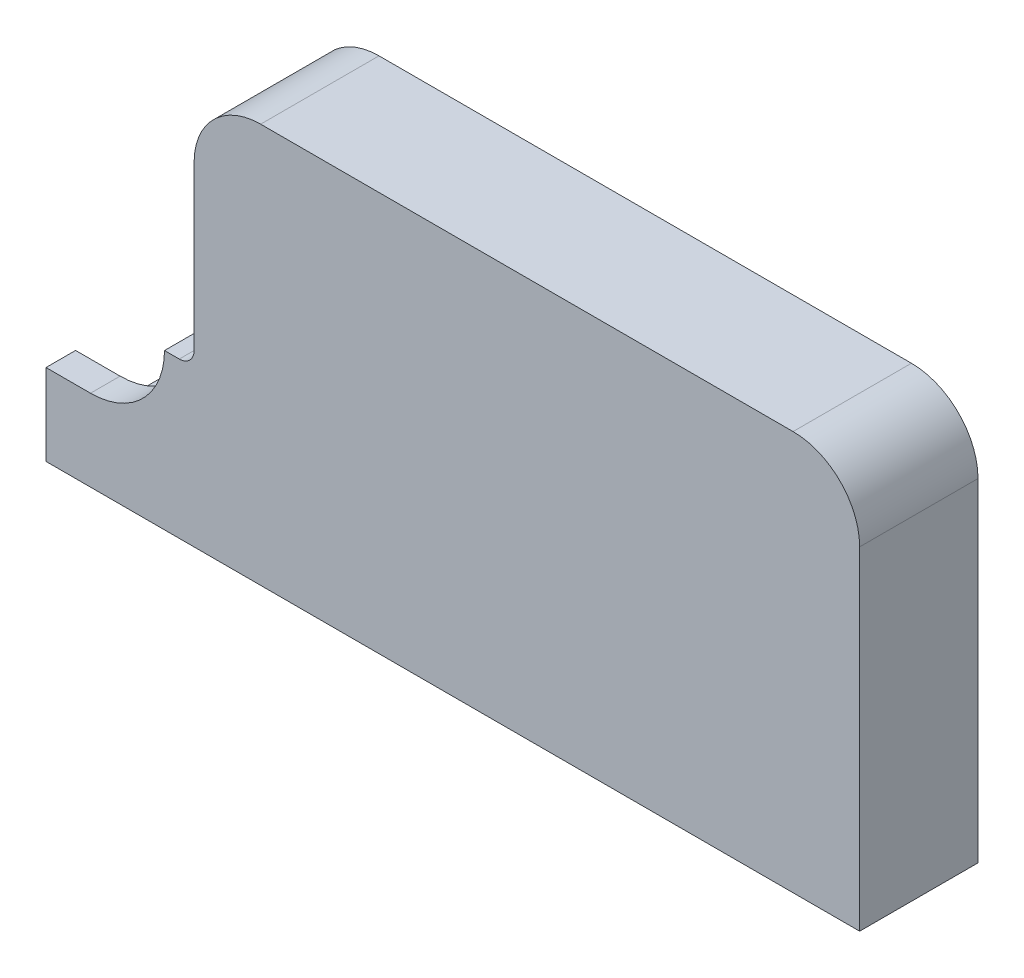
ISO-10303-21;
HEADER;
FILE_DESCRIPTION(('STEP AP214'),'2;1');
FILE_NAME('part.step','',(''),(''),'','','');
FILE_SCHEMA(('AUTOMOTIVE_DESIGN { 1 0 10303 214 1 1 1 1 }'));
ENDSEC;
DATA;
#1=APPLICATION_CONTEXT('core data for automotive mechanical design processes');
#2=APPLICATION_PROTOCOL_DEFINITION('international standard','automotive_design',2000,#1);
#3=PRODUCT_CONTEXT('',#1,'mechanical');
#4=PRODUCT('Part','Part','',(#3));
#5=PRODUCT_RELATED_PRODUCT_CATEGORY('part','',(#4));
#6=PRODUCT_DEFINITION_FORMATION('','',#4);
#7=PRODUCT_DEFINITION_CONTEXT('part definition',#1,'design');
#8=PRODUCT_DEFINITION('design','',#6,#7);
#9=PRODUCT_DEFINITION_SHAPE('','',#8);
#10=(LENGTH_UNIT() NAMED_UNIT(*) SI_UNIT(.MILLI.,.METRE.));
#11=(NAMED_UNIT(*) PLANE_ANGLE_UNIT() SI_UNIT($,.RADIAN.));
#12=(NAMED_UNIT(*) SI_UNIT($,.STERADIAN.) SOLID_ANGLE_UNIT());
#13=UNCERTAINTY_MEASURE_WITH_UNIT(LENGTH_MEASURE(1.E-05),#10,'distance_accuracy_value','');
#14=(GEOMETRIC_REPRESENTATION_CONTEXT(3) GLOBAL_UNCERTAINTY_ASSIGNED_CONTEXT((#13)) GLOBAL_UNIT_ASSIGNED_CONTEXT((#10,
#11,#12)) REPRESENTATION_CONTEXT('',''));
#15=CARTESIAN_POINT('',(0.,0.,0.));
#16=DIRECTION('',(0.,0.,1.));
#17=DIRECTION('',(1.,0.,0.));
#18=AXIS2_PLACEMENT_3D('',#15,#16,#17);
#19=CARTESIAN_POINT('',(15.009451629027,22.5275551799188,74.2698947281615));
#20=DIRECTION('',(0.,0.,-1.));
#21=DIRECTION('',(-1.,0.,0.));
#22=AXIS2_PLACEMENT_3D('',#19,#20,#21);
#23=CYLINDRICAL_SURFACE('',#22,3.5);
#24=DIRECTION('',(0.,0.,-1.));
#25=VECTOR('',#24,1.);
#26=CARTESIAN_POINT('',(15.009451629027,26.0275551799188,74.2698947281615));
#27=LINE('',#26,#25);
#28=CARTESIAN_POINT('',(15.009451629027,26.0275551799188,10.));
#29=VERTEX_POINT('',#28);
#30=CARTESIAN_POINT('',(15.009451629027,26.0275551799188,5.));
#31=VERTEX_POINT('',#30);
#32=EDGE_CURVE('E277',#29,#31,#27,.T.);
#33=ORIENTED_EDGE('',*,*,#32,.F.);
#34=CARTESIAN_POINT('',(15.009451629027,22.5275551799188,9.99999999999998));
#35=DIRECTION('',(0.,0.,1.));
#36=DIRECTION('',(1.,0.,0.));
#37=AXIS2_PLACEMENT_3D('',#34,#35,#36);
#38=CIRCLE('',#37,3.5);
#39=CARTESIAN_POINT('',(11.509451629027,22.5275551799188,10.));
#40=VERTEX_POINT('',#39);
#41=EDGE_CURVE('E342',#29,#40,#38,.T.);
#42=ORIENTED_EDGE('',*,*,#41,.T.);
#43=DIRECTION('',(0.,0.,-1.));
#44=VECTOR('',#43,1.);
#45=CARTESIAN_POINT('',(11.509451629027,22.5275551799188,74.2698947281615));
#46=LINE('',#45,#44);
#47=CARTESIAN_POINT('',(11.509451629027,22.5275551799188,5.));
#48=VERTEX_POINT('',#47);
#49=EDGE_CURVE('E225',#40,#48,#46,.T.);
#50=ORIENTED_EDGE('',*,*,#49,.T.);
#51=CARTESIAN_POINT('',(15.009451629027,22.5275551799188,5.));
#52=DIRECTION('',(0.,0.,-1.));
#53=DIRECTION('',(1.,0.,0.));
#54=AXIS2_PLACEMENT_3D('',#51,#52,#53);
#55=CIRCLE('',#54,3.5);
#56=EDGE_CURVE('E278',#48,#31,#55,.T.);
#57=ORIENTED_EDGE('',*,*,#56,.T.);
#58=EDGE_LOOP('',(#33,#42,#50,#57));
#59=FACE_BOUND('',#58,.T.);
#60=ADVANCED_FACE('F33',(#59),#23,.F.);
#61=CARTESIAN_POINT('',(15.009451629027,26.0275551799188,74.2698947281615));
#62=DIRECTION('',(0.,1.,0.));
#63=DIRECTION('',(0.,0.,1.));
#64=AXIS2_PLACEMENT_3D('',#61,#62,#63);
#65=PLANE('',#64);
#66=DIRECTION('',(0.,0.,-1.));
#67=VECTOR('',#66,1.);
#68=CARTESIAN_POINT('',(51.,26.0275551799188,74.2698947281615));
#69=LINE('',#68,#67);
#70=CARTESIAN_POINT('',(51.,26.0275551799188,10.));
#71=VERTEX_POINT('',#70);
#72=CARTESIAN_POINT('',(51.,26.0275551799188,5.));
#73=VERTEX_POINT('',#72);
#74=EDGE_CURVE('E273',#71,#73,#69,.T.);
#75=ORIENTED_EDGE('',*,*,#74,.F.);
#76=DIRECTION('',(1.,0.,0.));
#77=VECTOR('',#76,1.);
#78=CARTESIAN_POINT('',(15.009451629027,26.0275551799188,9.99999999999999));
#79=LINE('',#78,#77);
#80=EDGE_CURVE('E349',#71,#29,#79,.F.);
#81=ORIENTED_EDGE('',*,*,#80,.T.);
#82=ORIENTED_EDGE('',*,*,#32,.T.);
#83=DIRECTION('',(1.,0.,0.));
#84=VECTOR('',#83,1.);
#85=CARTESIAN_POINT('',(15.009451629027,26.0275551799188,5.));
#86=LINE('',#85,#84);
#87=EDGE_CURVE('E274',#31,#73,#86,.T.);
#88=ORIENTED_EDGE('',*,*,#87,.T.);
#89=EDGE_LOOP('',(#75,#81,#82,#88));
#90=FACE_BOUND('',#89,.T.);
#91=ADVANCED_FACE('F448',(#90),#65,.F.);
#92=CARTESIAN_POINT('',(51.,22.5275551799188,74.2698947281615));
#93=DIRECTION('',(0.,0.,-1.));
#94=DIRECTION('',(-1.,0.,0.));
#95=AXIS2_PLACEMENT_3D('',#92,#93,#94);
#96=CYLINDRICAL_SURFACE('',#95,3.49999999999999);
#97=DIRECTION('',(0.,0.,-1.));
#98=VECTOR('',#97,1.);
#99=CARTESIAN_POINT('',(54.5,22.5275551799188,74.2698947281615));
#100=LINE('',#99,#98);
#101=CARTESIAN_POINT('',(54.5,22.5275551799188,10.));
#102=VERTEX_POINT('',#101);
#103=CARTESIAN_POINT('',(54.5,22.5275551799188,5.));
#104=VERTEX_POINT('',#103);
#105=EDGE_CURVE('E269',#102,#104,#100,.T.);
#106=ORIENTED_EDGE('',*,*,#105,.F.);
#107=CARTESIAN_POINT('',(51.,22.5275551799188,9.99999999999998));
#108=DIRECTION('',(0.,0.,1.));
#109=DIRECTION('',(1.,0.,0.));
#110=AXIS2_PLACEMENT_3D('',#107,#108,#109);
#111=CIRCLE('',#110,3.49999999999999);
#112=EDGE_CURVE('E56',#102,#71,#111,.T.);
#113=ORIENTED_EDGE('',*,*,#112,.T.);
#114=ORIENTED_EDGE('',*,*,#74,.T.);
#115=CARTESIAN_POINT('',(51.,22.5275551799188,5.));
#116=DIRECTION('',(0.,0.,-1.));
#117=DIRECTION('',(1.,0.,0.));
#118=AXIS2_PLACEMENT_3D('',#115,#116,#117);
#119=CIRCLE('',#118,3.49999999999999);
#120=EDGE_CURVE('E270',#73,#104,#119,.T.);
#121=ORIENTED_EDGE('',*,*,#120,.T.);
#122=EDGE_LOOP('',(#106,#113,#114,#121));
#123=FACE_BOUND('',#122,.T.);
#124=ADVANCED_FACE('F454',(#123),#96,.F.);
#125=CARTESIAN_POINT('',(54.5,22.5275551799188,74.2698947281615));
#126=DIRECTION('',(1.,0.,0.));
#127=DIRECTION('',(0.,0.,-1.));
#128=AXIS2_PLACEMENT_3D('',#125,#126,#127);
#129=PLANE('',#128);
#130=DIRECTION('',(0.,0.,-1.));
#131=VECTOR('',#130,1.);
#132=CARTESIAN_POINT('',(54.5,1.02755517991877,74.2698947281615));
#133=LINE('',#132,#131);
#134=CARTESIAN_POINT('',(54.5,1.02755517991877,10.));
#135=VERTEX_POINT('',#134);
#136=CARTESIAN_POINT('',(54.5,1.02755517991877,5.));
#137=VERTEX_POINT('',#136);
#138=EDGE_CURVE('E265',#135,#137,#133,.T.);
#139=ORIENTED_EDGE('',*,*,#138,.F.);
#140=DIRECTION('',(0.,-1.,0.));
#141=VECTOR('',#140,1.);
#142=CARTESIAN_POINT('',(54.5,22.5275551799188,9.99999999999999));
#143=LINE('',#142,#141);
#144=EDGE_CURVE('E344',#135,#102,#143,.F.);
#145=ORIENTED_EDGE('',*,*,#144,.T.);
#146=ORIENTED_EDGE('',*,*,#105,.T.);
#147=DIRECTION('',(0.,-1.,0.));
#148=VECTOR('',#147,1.);
#149=CARTESIAN_POINT('',(54.5,22.5275551799188,5.));
#150=LINE('',#149,#148);
#151=EDGE_CURVE('E266',#104,#137,#150,.T.);
#152=ORIENTED_EDGE('',*,*,#151,.T.);
#153=EDGE_LOOP('',(#139,#145,#146,#152));
#154=FACE_BOUND('',#153,.T.);
#155=ADVANCED_FACE('F378',(#154),#129,.F.);
#156=CARTESIAN_POINT('',(1.5,1.02755517991876,74.2698947281615));
#157=DIRECTION('',(0.,-1.,0.));
#158=DIRECTION('',(0.,0.,-1.));
#159=AXIS2_PLACEMENT_3D('',#156,#157,#158);
#160=PLANE('',#159);
#161=DIRECTION('',(0.,0.,-1.));
#162=VECTOR('',#161,1.);
#163=CARTESIAN_POINT('',(0.5,1.02755517991876,74.2698947281615));
#164=LINE('',#163,#162);
#165=CARTESIAN_POINT('',(0.5,1.02755517991876,10.));
#166=VERTEX_POINT('',#165);
#167=CARTESIAN_POINT('',(0.5,1.02755517991876,5.));
#168=VERTEX_POINT('',#167);
#169=EDGE_CURVE('E261',#166,#168,#164,.T.);
#170=ORIENTED_EDGE('',*,*,#169,.F.);
#171=DIRECTION('',(-1.,0.,0.));
#172=VECTOR('',#171,1.);
#173=CARTESIAN_POINT('',(54.5,1.02755517991876,9.99999999999999));
#174=LINE('',#173,#172);
#175=EDGE_CURVE('E347',#166,#135,#174,.F.);
#176=ORIENTED_EDGE('',*,*,#175,.T.);
#177=ORIENTED_EDGE('',*,*,#138,.T.);
#178=DIRECTION('',(-1.,0.,0.));
#179=VECTOR('',#178,1.);
#180=CARTESIAN_POINT('',(1.5,1.02755517991876,5.));
#181=LINE('',#180,#179);
#182=EDGE_CURVE('E262',#137,#168,#181,.T.);
#183=ORIENTED_EDGE('',*,*,#182,.T.);
#184=EDGE_LOOP('',(#170,#176,#177,#183));
#185=FACE_BOUND('',#184,.T.);
#186=ADVANCED_FACE('F375',(#185),#160,.F.);
#187=CARTESIAN_POINT('',(10.509451629027,13.5275551799188,74.2698947281615));
#188=DIRECTION('',(0.,1.,0.));
#189=DIRECTION('',(0.,0.,1.));
#190=AXIS2_PLACEMENT_3D('',#187,#188,#189);
#191=PLANE('',#190);
#192=DIRECTION('',(1.,0.,0.));
#193=VECTOR('',#192,1.);
#194=CARTESIAN_POINT('',(10.509451629027,13.5275551799188,11.));
#195=LINE('',#194,#193);
#196=CARTESIAN_POINT('',(10.509451629027,13.5275551799188,11.));
#197=VERTEX_POINT('',#196);
#198=CARTESIAN_POINT('',(12.509451629027,13.5275551799188,11.));
#199=VERTEX_POINT('',#198);
#200=EDGE_CURVE('E222',#197,#199,#195,.T.);
#201=ORIENTED_EDGE('',*,*,#200,.F.);
#202=DIRECTION('',(0.,0.,-1.));
#203=VECTOR('',#202,1.);
#204=CARTESIAN_POINT('',(10.509451629027,13.5275551799188,74.2698947281615));
#205=LINE('',#204,#203);
#206=CARTESIAN_POINT('',(10.509451629027,13.5275551799188,5.));
#207=VERTEX_POINT('',#206);
#208=EDGE_CURVE('E233',#197,#207,#205,.T.);
#209=ORIENTED_EDGE('',*,*,#208,.T.);
#210=DIRECTION('',(1.,0.,0.));
#211=VECTOR('',#210,1.);
#212=CARTESIAN_POINT('',(10.509451629027,13.5275551799188,5.));
#213=LINE('',#212,#211);
#214=CARTESIAN_POINT('',(11.509451629027,13.5275551799188,5.));
#215=VERTEX_POINT('',#214);
#216=EDGE_CURVE('E230',#207,#215,#213,.T.);
#217=ORIENTED_EDGE('',*,*,#216,.T.);
#218=DIRECTION('',(0.,0.,-1.));
#219=VECTOR('',#218,1.);
#220=CARTESIAN_POINT('',(11.509451629027,13.5275551799188,74.2698947281615));
#221=LINE('',#220,#219);
#222=CARTESIAN_POINT('',(11.509451629027,13.5275551799188,10.));
#223=VERTEX_POINT('',#222);
#224=EDGE_CURVE('E229',#223,#215,#221,.T.);
#225=ORIENTED_EDGE('',*,*,#224,.F.);
#226=CARTESIAN_POINT('',(12.509451629027,13.5275551799188,9.99999999999999));
#227=DIRECTION('',(0.,1.,0.));
#228=DIRECTION('',(0.,0.,1.));
#229=AXIS2_PLACEMENT_3D('',#226,#227,#228);
#230=CIRCLE('',#229,1.);
#231=EDGE_CURVE('E42',#223,#199,#230,.T.);
#232=ORIENTED_EDGE('',*,*,#231,.T.);
#233=EDGE_LOOP('',(#201,#209,#217,#225,#232));
#234=FACE_BOUND('',#233,.T.);
#235=ADVANCED_FACE('F421',(#234),#191,.F.);
#236=CARTESIAN_POINT('',(11.509451629027,13.5275551799188,74.2698947281615));
#237=DIRECTION('',(-1.,0.,0.));
#238=DIRECTION('',(0.,-1.,0.));
#239=AXIS2_PLACEMENT_3D('',#236,#237,#238);
#240=PLANE('',#239);
#241=ORIENTED_EDGE('',*,*,#49,.F.);
#242=DIRECTION('',(0.,1.,0.));
#243=VECTOR('',#242,1.);
#244=CARTESIAN_POINT('',(11.509451629027,13.5275551799188,9.99999999999999));
#245=LINE('',#244,#243);
#246=EDGE_CURVE('E340',#40,#223,#245,.F.);
#247=ORIENTED_EDGE('',*,*,#246,.T.);
#248=ORIENTED_EDGE('',*,*,#224,.T.);
#249=DIRECTION('',(0.,1.,0.));
#250=VECTOR('',#249,1.);
#251=CARTESIAN_POINT('',(11.509451629027,13.5275551799188,5.));
#252=LINE('',#251,#250);
#253=EDGE_CURVE('E226',#215,#48,#252,.T.);
#254=ORIENTED_EDGE('',*,*,#253,.T.);
#255=EDGE_LOOP('',(#241,#247,#248,#254));
#256=FACE_BOUND('',#255,.T.);
#257=ADVANCED_FACE('F625',(#256),#240,.F.);
#258=CARTESIAN_POINT('',(0.5,0.0275551799187663,74.2698947281615));
#259=DIRECTION('',(1.,0.,0.));
#260=DIRECTION('',(0.,1.,0.));
#261=AXIS2_PLACEMENT_3D('',#258,#259,#260);
#262=PLANE('',#261);
#263=DIRECTION('',(0.,-1.,0.));
#264=VECTOR('',#263,1.);
#265=CARTESIAN_POINT('',(0.5,0.0275551799187663,13.));
#266=LINE('',#265,#264);
#267=CARTESIAN_POINT('',(0.5,5.52755517991876,13.));
#268=VERTEX_POINT('',#267);
#269=CARTESIAN_POINT('',(0.5,0.0275551799187663,13.));
#270=VERTEX_POINT('',#269);
#271=EDGE_CURVE('E205',#268,#270,#266,.T.);
#272=ORIENTED_EDGE('',*,*,#271,.F.);
#273=DIRECTION('',(0.,0.,1.));
#274=VECTOR('',#273,1.);
#275=CARTESIAN_POINT('',(0.5,5.52755517991876,11.));
#276=LINE('',#275,#274);
#277=CARTESIAN_POINT('',(0.5,5.52755517991876,11.));
#278=VERTEX_POINT('',#277);
#279=EDGE_CURVE('E191',#278,#268,#276,.T.);
#280=ORIENTED_EDGE('',*,*,#279,.F.);
#281=DIRECTION('',(0.,-1.,0.));
#282=VECTOR('',#281,1.);
#283=CARTESIAN_POINT('',(0.5,1.02755517991876,11.));
#284=LINE('',#283,#282);
#285=CARTESIAN_POINT('',(0.5,2.02755517991876,11.));
#286=VERTEX_POINT('',#285);
#287=EDGE_CURVE('E198',#278,#286,#284,.T.);
#288=ORIENTED_EDGE('',*,*,#287,.T.);
#289=CARTESIAN_POINT('',(0.5,2.02755517991876,9.99999999999999));
#290=DIRECTION('',(1.,0.,0.));
#291=DIRECTION('',(0.,1.,0.));
#292=AXIS2_PLACEMENT_3D('',#289,#290,#291);
#293=CIRCLE('',#292,1.);
#294=EDGE_CURVE('E11',#286,#166,#293,.T.);
#295=ORIENTED_EDGE('',*,*,#294,.T.);
#296=ORIENTED_EDGE('',*,*,#169,.T.);
#297=DIRECTION('',(0.,-1.,0.));
#298=VECTOR('',#297,1.);
#299=CARTESIAN_POINT('',(0.5,0.0275551799187663,5.));
#300=LINE('',#299,#298);
#301=CARTESIAN_POINT('',(0.5,0.0275551799187663,5.));
#302=VERTEX_POINT('',#301);
#303=EDGE_CURVE('E258',#168,#302,#300,.T.);
#304=ORIENTED_EDGE('',*,*,#303,.T.);
#305=DIRECTION('',(0.,0.,-1.));
#306=VECTOR('',#305,1.);
#307=CARTESIAN_POINT('',(0.5,0.0275551799187663,74.2698947281615));
#308=LINE('',#307,#306);
#309=EDGE_CURVE('E257',#270,#302,#308,.T.);
#310=ORIENTED_EDGE('',*,*,#309,.F.);
#311=EDGE_LOOP('',(#272,#280,#288,#295,#296,#304,#310));
#312=FACE_BOUND('',#311,.T.);
#313=ADVANCED_FACE('F202',(#312),#262,.F.);
#314=CARTESIAN_POINT('',(55.5,0.0275551799187663,74.2698947281615));
#315=DIRECTION('',(0.,1.,0.));
#316=DIRECTION('',(0.,0.,1.));
#317=AXIS2_PLACEMENT_3D('',#314,#315,#316);
#318=PLANE('',#317);
#319=ORIENTED_EDGE('',*,*,#309,.T.);
#320=DIRECTION('',(1.,0.,0.));
#321=VECTOR('',#320,1.);
#322=CARTESIAN_POINT('',(55.5,0.0275551799187663,5.));
#323=LINE('',#322,#321);
#324=CARTESIAN_POINT('',(55.5,0.0275551799187663,5.));
#325=VERTEX_POINT('',#324);
#326=EDGE_CURVE('E254',#302,#325,#323,.T.);
#327=ORIENTED_EDGE('',*,*,#326,.T.);
#328=DIRECTION('',(0.,0.,-1.));
#329=VECTOR('',#328,1.);
#330=CARTESIAN_POINT('',(55.5,0.0275551799187663,74.2698947281615));
#331=LINE('',#330,#329);
#332=CARTESIAN_POINT('',(55.5,0.0275551799187663,13.));
#333=VERTEX_POINT('',#332);
#334=EDGE_CURVE('E253',#333,#325,#331,.T.);
#335=ORIENTED_EDGE('',*,*,#334,.F.);
#336=DIRECTION('',(1.,0.,0.));
#337=VECTOR('',#336,1.);
#338=CARTESIAN_POINT('',(55.5,0.0275551799187663,13.));
#339=LINE('',#338,#337);
#340=EDGE_CURVE('E296',#270,#333,#339,.T.);
#341=ORIENTED_EDGE('',*,*,#340,.F.);
#342=EDGE_LOOP('',(#319,#327,#335,#341));
#343=FACE_BOUND('',#342,.T.);
#344=ADVANCED_FACE('F578',(#343),#318,.F.);
#345=CARTESIAN_POINT('',(55.5,22.5275551799188,74.2698947281615));
#346=DIRECTION('',(-1.,0.,0.));
#347=DIRECTION('',(0.,0.,1.));
#348=AXIS2_PLACEMENT_3D('',#345,#346,#347);
#349=PLANE('',#348);
#350=ORIENTED_EDGE('',*,*,#334,.T.);
#351=DIRECTION('',(0.,1.,0.));
#352=VECTOR('',#351,1.);
#353=CARTESIAN_POINT('',(55.5,22.5275551799188,5.));
#354=LINE('',#353,#352);
#355=CARTESIAN_POINT('',(55.5,22.5275551799188,5.));
#356=VERTEX_POINT('',#355);
#357=EDGE_CURVE('E250',#325,#356,#354,.T.);
#358=ORIENTED_EDGE('',*,*,#357,.T.);
#359=DIRECTION('',(0.,0.,-1.));
#360=VECTOR('',#359,1.);
#361=CARTESIAN_POINT('',(55.5,22.5275551799188,74.2698947281615));
#362=LINE('',#361,#360);
#363=CARTESIAN_POINT('',(55.5,22.5275551799188,13.));
#364=VERTEX_POINT('',#363);
#365=EDGE_CURVE('E249',#364,#356,#362,.T.);
#366=ORIENTED_EDGE('',*,*,#365,.F.);
#367=DIRECTION('',(0.,1.,0.));
#368=VECTOR('',#367,1.);
#369=CARTESIAN_POINT('',(55.5,22.5275551799188,13.));
#370=LINE('',#369,#368);
#371=EDGE_CURVE('E293',#333,#364,#370,.T.);
#372=ORIENTED_EDGE('',*,*,#371,.F.);
#373=EDGE_LOOP('',(#350,#358,#366,#372));
#374=FACE_BOUND('',#373,.T.);
#375=ADVANCED_FACE('F583',(#374),#349,.F.);
#376=CARTESIAN_POINT('',(51.,22.5275551799188,74.2698947281615));
#377=DIRECTION('',(0.,0.,-1.));
#378=DIRECTION('',(-1.,0.,0.));
#379=AXIS2_PLACEMENT_3D('',#376,#377,#378);
#380=CYLINDRICAL_SURFACE('',#379,4.5);
#381=ORIENTED_EDGE('',*,*,#365,.T.);
#382=CARTESIAN_POINT('',(51.,22.5275551799188,5.));
#383=DIRECTION('',(0.,0.,1.));
#384=DIRECTION('',(1.,0.,0.));
#385=AXIS2_PLACEMENT_3D('',#382,#383,#384);
#386=CIRCLE('',#385,4.5);
#387=CARTESIAN_POINT('',(51.,27.0275551799188,5.));
#388=VERTEX_POINT('',#387);
#389=EDGE_CURVE('E246',#356,#388,#386,.T.);
#390=ORIENTED_EDGE('',*,*,#389,.T.);
#391=DIRECTION('',(0.,0.,-1.));
#392=VECTOR('',#391,1.);
#393=CARTESIAN_POINT('',(51.,27.0275551799188,74.2698947281615));
#394=LINE('',#393,#392);
#395=CARTESIAN_POINT('',(51.,27.0275551799188,13.));
#396=VERTEX_POINT('',#395);
#397=EDGE_CURVE('E245',#396,#388,#394,.T.);
#398=ORIENTED_EDGE('',*,*,#397,.F.);
#399=CARTESIAN_POINT('',(51.,22.5275551799188,13.));
#400=DIRECTION('',(0.,0.,1.));
#401=DIRECTION('',(1.,0.,0.));
#402=AXIS2_PLACEMENT_3D('',#399,#400,#401);
#403=CIRCLE('',#402,4.5);
#404=EDGE_CURVE('E290',#364,#396,#403,.T.);
#405=ORIENTED_EDGE('',*,*,#404,.F.);
#406=EDGE_LOOP('',(#381,#390,#398,#405));
#407=FACE_BOUND('',#406,.T.);
#408=ADVANCED_FACE('F594',(#407),#380,.T.);
#409=CARTESIAN_POINT('',(15.009451629027,27.0275551799188,74.2698947281615));
#410=DIRECTION('',(0.,-1.,0.));
#411=DIRECTION('',(1.,0.,0.));
#412=AXIS2_PLACEMENT_3D('',#409,#410,#411);
#413=PLANE('',#412);
#414=ORIENTED_EDGE('',*,*,#397,.T.);
#415=DIRECTION('',(-1.,0.,0.));
#416=VECTOR('',#415,1.);
#417=CARTESIAN_POINT('',(15.009451629027,27.0275551799188,5.));
#418=LINE('',#417,#416);
#419=CARTESIAN_POINT('',(15.009451629027,27.0275551799188,5.));
#420=VERTEX_POINT('',#419);
#421=EDGE_CURVE('E242',#388,#420,#418,.T.);
#422=ORIENTED_EDGE('',*,*,#421,.T.);
#423=DIRECTION('',(0.,0.,-1.));
#424=VECTOR('',#423,1.);
#425=CARTESIAN_POINT('',(15.009451629027,27.0275551799188,74.2698947281615));
#426=LINE('',#425,#424);
#427=CARTESIAN_POINT('',(15.009451629027,27.0275551799188,13.));
#428=VERTEX_POINT('',#427);
#429=EDGE_CURVE('E241',#428,#420,#426,.T.);
#430=ORIENTED_EDGE('',*,*,#429,.F.);
#431=DIRECTION('',(-1.,0.,0.));
#432=VECTOR('',#431,1.);
#433=CARTESIAN_POINT('',(15.009451629027,27.0275551799188,13.));
#434=LINE('',#433,#432);
#435=EDGE_CURVE('E287',#396,#428,#434,.T.);
#436=ORIENTED_EDGE('',*,*,#435,.F.);
#437=EDGE_LOOP('',(#414,#422,#430,#436));
#438=FACE_BOUND('',#437,.T.);
#439=ADVANCED_FACE('F411',(#438),#413,.F.);
#440=CARTESIAN_POINT('',(15.009451629027,22.5275551799188,74.2698947281615));
#441=DIRECTION('',(0.,0.,-1.));
#442=DIRECTION('',(-1.,0.,0.));
#443=AXIS2_PLACEMENT_3D('',#440,#441,#442);
#444=CYLINDRICAL_SURFACE('',#443,4.5);
#445=ORIENTED_EDGE('',*,*,#429,.T.);
#446=CARTESIAN_POINT('',(15.009451629027,22.5275551799188,5.));
#447=DIRECTION('',(0.,0.,1.));
#448=DIRECTION('',(1.,0.,0.));
#449=AXIS2_PLACEMENT_3D('',#446,#447,#448);
#450=CIRCLE('',#449,4.5);
#451=CARTESIAN_POINT('',(10.509451629027,22.5275551799188,5.));
#452=VERTEX_POINT('',#451);
#453=EDGE_CURVE('E238',#420,#452,#450,.T.);
#454=ORIENTED_EDGE('',*,*,#453,.T.);
#455=DIRECTION('',(0.,0.,-1.));
#456=VECTOR('',#455,1.);
#457=CARTESIAN_POINT('',(10.509451629027,22.5275551799188,74.2698947281615));
#458=LINE('',#457,#456);
#459=CARTESIAN_POINT('',(10.509451629027,22.5275551799188,13.));
#460=VERTEX_POINT('',#459);
#461=EDGE_CURVE('E237',#460,#452,#458,.T.);
#462=ORIENTED_EDGE('',*,*,#461,.F.);
#463=CARTESIAN_POINT('',(15.009451629027,22.5275551799188,13.));
#464=DIRECTION('',(0.,0.,1.));
#465=DIRECTION('',(1.,0.,0.));
#466=AXIS2_PLACEMENT_3D('',#463,#464,#465);
#467=CIRCLE('',#466,4.5);
#468=EDGE_CURVE('E284',#428,#460,#467,.T.);
#469=ORIENTED_EDGE('',*,*,#468,.F.);
#470=EDGE_LOOP('',(#445,#454,#462,#469));
#471=FACE_BOUND('',#470,.T.);
#472=ADVANCED_FACE('F409',(#471),#444,.T.);
#473=CARTESIAN_POINT('',(10.509451629027,13.5275551799188,74.2698947281615));
#474=DIRECTION('',(1.,0.,0.));
#475=DIRECTION('',(0.,0.,-1.));
#476=AXIS2_PLACEMENT_3D('',#473,#474,#475);
#477=PLANE('',#476);
#478=DIRECTION('',(0.,-1.,0.));
#479=VECTOR('',#478,1.);
#480=CARTESIAN_POINT('',(10.509451629027,22.5275551799188,11.));
#481=LINE('',#480,#479);
#482=CARTESIAN_POINT('',(10.509451629027,11.5275551799188,11.));
#483=VERTEX_POINT('',#482);
#484=EDGE_CURVE('E212',#197,#483,#481,.T.);
#485=ORIENTED_EDGE('',*,*,#484,.T.);
#486=DIRECTION('',(0.,0.,1.));
#487=VECTOR('',#486,1.);
#488=CARTESIAN_POINT('',(10.509451629027,11.5275551799188,74.2698947281615));
#489=LINE('',#488,#487);
#490=CARTESIAN_POINT('',(10.509451629027,11.5275551799188,13.));
#491=VERTEX_POINT('',#490);
#492=EDGE_CURVE('E319',#483,#491,#489,.T.);
#493=ORIENTED_EDGE('',*,*,#492,.T.);
#494=DIRECTION('',(0.,-1.,0.));
#495=VECTOR('',#494,1.);
#496=CARTESIAN_POINT('',(10.509451629027,13.5275551799188,13.));
#497=LINE('',#496,#495);
#498=EDGE_CURVE('E281',#460,#491,#497,.T.);
#499=ORIENTED_EDGE('',*,*,#498,.F.);
#500=ORIENTED_EDGE('',*,*,#461,.T.);
#501=DIRECTION('',(0.,-1.,0.));
#502=VECTOR('',#501,1.);
#503=CARTESIAN_POINT('',(10.509451629027,13.5275551799188,5.));
#504=LINE('',#503,#502);
#505=EDGE_CURVE('E234',#452,#207,#504,.T.);
#506=ORIENTED_EDGE('',*,*,#505,.T.);
#507=ORIENTED_EDGE('',*,*,#208,.F.);
#508=EDGE_LOOP('',(#485,#493,#499,#500,#506,#507));
#509=FACE_BOUND('',#508,.T.);
#510=ADVANCED_FACE('F403',(#509),#477,.F.);
#511=CARTESIAN_POINT('',(15.009451629027,22.5275551799188,5.));
#512=DIRECTION('',(0.,0.,1.));
#513=DIRECTION('',(1.,0.,0.));
#514=AXIS2_PLACEMENT_3D('',#511,#512,#513);
#515=PLANE('',#514);
#516=ORIENTED_EDGE('',*,*,#56,.F.);
#517=ORIENTED_EDGE('',*,*,#253,.F.);
#518=ORIENTED_EDGE('',*,*,#216,.F.);
#519=ORIENTED_EDGE('',*,*,#505,.F.);
#520=ORIENTED_EDGE('',*,*,#453,.F.);
#521=ORIENTED_EDGE('',*,*,#421,.F.);
#522=ORIENTED_EDGE('',*,*,#389,.F.);
#523=ORIENTED_EDGE('',*,*,#357,.F.);
#524=ORIENTED_EDGE('',*,*,#326,.F.);
#525=ORIENTED_EDGE('',*,*,#303,.F.);
#526=ORIENTED_EDGE('',*,*,#182,.F.);
#527=ORIENTED_EDGE('',*,*,#151,.F.);
#528=ORIENTED_EDGE('',*,*,#120,.F.);
#529=ORIENTED_EDGE('',*,*,#87,.F.);
#530=EDGE_LOOP('',(#516,#517,#518,#519,#520,#521,#522,#523,#524,#525,#526,#527,#528,#529));
#531=FACE_BOUND('',#530,.T.);
#532=ADVANCED_FACE('F383',(#531),#515,.F.);
#533=CARTESIAN_POINT('',(51.,22.5275551799188,13.));
#534=DIRECTION('',(0.,0.,1.));
#535=DIRECTION('',(1.,0.,0.));
#536=AXIS2_PLACEMENT_3D('',#533,#534,#535);
#537=PLANE('',#536);
#538=ORIENTED_EDGE('',*,*,#498,.T.);
#539=CARTESIAN_POINT('',(9.50945162902703,11.5275551799188,13.));
#540=DIRECTION('',(0.,0.,1.));
#541=DIRECTION('',(1.,0.,0.));
#542=AXIS2_PLACEMENT_3D('',#539,#540,#541);
#543=CIRCLE('',#542,1.);
#544=CARTESIAN_POINT('',(9.50945162902703,10.5275551799188,13.));
#545=VERTEX_POINT('',#544);
#546=EDGE_CURVE('E324',#491,#545,#543,.F.);
#547=ORIENTED_EDGE('',*,*,#546,.T.);
#548=DIRECTION('',(-1.,0.,0.));
#549=VECTOR('',#548,1.);
#550=CARTESIAN_POINT('',(8.50945162902703,10.5275551799188,13.));
#551=LINE('',#550,#549);
#552=CARTESIAN_POINT('',(8.50945162902703,10.5275551799188,13.));
#553=VERTEX_POINT('',#552);
#554=EDGE_CURVE('E199',#545,#553,#551,.T.);
#555=ORIENTED_EDGE('',*,*,#554,.T.);
#556=CARTESIAN_POINT('',(3.50945162902703,10.5275551799188,13.));
#557=DIRECTION('',(0.,0.,1.));
#558=DIRECTION('',(1.,0.,0.));
#559=AXIS2_PLACEMENT_3D('',#556,#557,#558);
#560=CIRCLE('',#559,5.);
#561=CARTESIAN_POINT('',(3.50945162902703,5.52755517991876,13.));
#562=VERTEX_POINT('',#561);
#563=EDGE_CURVE('E315',#553,#562,#560,.F.);
#564=ORIENTED_EDGE('',*,*,#563,.T.);
#565=DIRECTION('',(-1.,0.,0.));
#566=VECTOR('',#565,1.);
#567=CARTESIAN_POINT('',(0.5,5.52755517991876,13.));
#568=LINE('',#567,#566);
#569=EDGE_CURVE('E218',#562,#268,#568,.T.);
#570=ORIENTED_EDGE('',*,*,#569,.T.);
#571=ORIENTED_EDGE('',*,*,#271,.T.);
#572=ORIENTED_EDGE('',*,*,#340,.T.);
#573=ORIENTED_EDGE('',*,*,#371,.T.);
#574=ORIENTED_EDGE('',*,*,#404,.T.);
#575=ORIENTED_EDGE('',*,*,#435,.T.);
#576=ORIENTED_EDGE('',*,*,#468,.T.);
#577=EDGE_LOOP('',(#538,#547,#555,#564,#570,#571,#572,#573,#574,#575,#576));
#578=FACE_BOUND('',#577,.T.);
#579=ADVANCED_FACE('F390',(#578),#537,.T.);
#580=CARTESIAN_POINT('',(15.009451629027,22.5275551799188,11.));
#581=DIRECTION('',(0.,0.,1.));
#582=DIRECTION('',(1.,0.,0.));
#583=AXIS2_PLACEMENT_3D('',#580,#581,#582);
#584=PLANE('',#583);
#585=ORIENTED_EDGE('',*,*,#200,.T.);
#586=DIRECTION('',(0.,1.,0.));
#587=VECTOR('',#586,1.);
#588=CARTESIAN_POINT('',(12.509451629027,22.5275551799188,11.));
#589=LINE('',#588,#587);
#590=CARTESIAN_POINT('',(12.509451629027,22.5275551799188,11.));
#591=VERTEX_POINT('',#590);
#592=EDGE_CURVE('E336',#199,#591,#589,.T.);
#593=ORIENTED_EDGE('',*,*,#592,.T.);
#594=CARTESIAN_POINT('',(15.009451629027,22.5275551799188,11.));
#595=DIRECTION('',(0.,0.,1.));
#596=DIRECTION('',(1.,0.,0.));
#597=AXIS2_PLACEMENT_3D('',#594,#595,#596);
#598=CIRCLE('',#597,2.5);
#599=CARTESIAN_POINT('',(15.009451629027,25.0275551799188,11.));
#600=VERTEX_POINT('',#599);
#601=EDGE_CURVE('E334',#591,#600,#598,.F.);
#602=ORIENTED_EDGE('',*,*,#601,.T.);
#603=DIRECTION('',(1.,0.,0.));
#604=VECTOR('',#603,1.);
#605=CARTESIAN_POINT('',(51.,25.0275551799188,11.));
#606=LINE('',#605,#604);
#607=CARTESIAN_POINT('',(51.,25.0275551799188,11.));
#608=VERTEX_POINT('',#607);
#609=EDGE_CURVE('E328',#600,#608,#606,.T.);
#610=ORIENTED_EDGE('',*,*,#609,.T.);
#611=CARTESIAN_POINT('',(51.,22.5275551799188,11.));
#612=DIRECTION('',(0.,0.,1.));
#613=DIRECTION('',(1.,0.,0.));
#614=AXIS2_PLACEMENT_3D('',#611,#612,#613);
#615=CIRCLE('',#614,2.49999999999999);
#616=CARTESIAN_POINT('',(53.5,22.5275551799188,11.));
#617=VERTEX_POINT('',#616);
#618=EDGE_CURVE('E330',#608,#617,#615,.F.);
#619=ORIENTED_EDGE('',*,*,#618,.T.);
#620=DIRECTION('',(0.,-1.,0.));
#621=VECTOR('',#620,1.);
#622=CARTESIAN_POINT('',(53.5,1.02755517991877,11.));
#623=LINE('',#622,#621);
#624=CARTESIAN_POINT('',(53.5,2.02755517991876,11.));
#625=VERTEX_POINT('',#624);
#626=EDGE_CURVE('E332',#617,#625,#623,.T.);
#627=ORIENTED_EDGE('',*,*,#626,.T.);
#628=DIRECTION('',(-1.,0.,0.));
#629=VECTOR('',#628,1.);
#630=CARTESIAN_POINT('',(0.5,2.02755517991876,11.));
#631=LINE('',#630,#629);
#632=EDGE_CURVE('E211',#625,#286,#631,.T.);
#633=ORIENTED_EDGE('',*,*,#632,.T.);
#634=ORIENTED_EDGE('',*,*,#287,.F.);
#635=DIRECTION('',(-1.,0.,0.));
#636=VECTOR('',#635,1.);
#637=CARTESIAN_POINT('',(0.5,5.52755517991876,11.));
#638=LINE('',#637,#636);
#639=CARTESIAN_POINT('',(3.50945162902703,5.52755517991876,11.));
#640=VERTEX_POINT('',#639);
#641=EDGE_CURVE('E187',#640,#278,#638,.T.);
#642=ORIENTED_EDGE('',*,*,#641,.F.);
#643=CARTESIAN_POINT('',(3.50945162902703,10.5275551799188,11.));
#644=DIRECTION('',(0.,0.,1.));
#645=DIRECTION('',(1.,0.,0.));
#646=AXIS2_PLACEMENT_3D('',#643,#644,#645);
#647=CIRCLE('',#646,5.);
#648=CARTESIAN_POINT('',(8.50945162902703,10.5275551799188,11.));
#649=VERTEX_POINT('',#648);
#650=EDGE_CURVE('E317',#640,#649,#647,.T.);
#651=ORIENTED_EDGE('',*,*,#650,.T.);
#652=DIRECTION('',(-1.,0.,0.));
#653=VECTOR('',#652,1.);
#654=CARTESIAN_POINT('',(8.50945162902703,10.5275551799188,11.));
#655=LINE('',#654,#653);
#656=CARTESIAN_POINT('',(9.50945162902703,10.5275551799188,11.));
#657=VERTEX_POINT('',#656);
#658=EDGE_CURVE('E207',#657,#649,#655,.T.);
#659=ORIENTED_EDGE('',*,*,#658,.F.);
#660=CARTESIAN_POINT('',(9.50945162902703,11.5275551799188,11.));
#661=DIRECTION('',(0.,0.,1.));
#662=DIRECTION('',(1.,0.,0.));
#663=AXIS2_PLACEMENT_3D('',#660,#661,#662);
#664=CIRCLE('',#663,1.);
#665=EDGE_CURVE('E326',#657,#483,#664,.T.);
#666=ORIENTED_EDGE('',*,*,#665,.T.);
#667=ORIENTED_EDGE('',*,*,#484,.F.);
#668=EDGE_LOOP('',(#585,#593,#602,#610,#619,#627,#633,#634,#642,#651,#659,#666,#667));
#669=FACE_BOUND('',#668,.T.);
#670=ADVANCED_FACE('F209',(#669),#584,.F.);
#671=CARTESIAN_POINT('',(8.50945162902703,10.5275551799188,11.));
#672=DIRECTION('',(0.,1.,0.));
#673=DIRECTION('',(0.,0.,1.));
#674=AXIS2_PLACEMENT_3D('',#671,#672,#673);
#675=PLANE('',#674);
#676=ORIENTED_EDGE('',*,*,#554,.F.);
#677=DIRECTION('',(0.,0.,1.));
#678=VECTOR('',#677,1.);
#679=CARTESIAN_POINT('',(9.50945162902703,10.5275551799188,11.));
#680=LINE('',#679,#678);
#681=EDGE_CURVE('E322',#545,#657,#680,.F.);
#682=ORIENTED_EDGE('',*,*,#681,.T.);
#683=ORIENTED_EDGE('',*,*,#658,.T.);
#684=DIRECTION('',(0.,0.,1.));
#685=VECTOR('',#684,1.);
#686=CARTESIAN_POINT('',(8.50945162902703,10.5275551799188,11.));
#687=LINE('',#686,#685);
#688=EDGE_CURVE('E206',#649,#553,#687,.T.);
#689=ORIENTED_EDGE('',*,*,#688,.T.);
#690=EDGE_LOOP('',(#676,#682,#683,#689));
#691=FACE_BOUND('',#690,.T.);
#692=ADVANCED_FACE('F521',(#691),#675,.T.);
#693=CARTESIAN_POINT('',(0.5,5.52755517991876,11.));
#694=DIRECTION('',(0.,1.,0.));
#695=DIRECTION('',(0.,0.,1.));
#696=AXIS2_PLACEMENT_3D('',#693,#694,#695);
#697=PLANE('',#696);
#698=ORIENTED_EDGE('',*,*,#569,.F.);
#699=DIRECTION('',(0.,0.,1.));
#700=VECTOR('',#699,1.);
#701=CARTESIAN_POINT('',(3.50945162902703,5.52755517991876,11.));
#702=LINE('',#701,#700);
#703=EDGE_CURVE('E193',#562,#640,#702,.F.);
#704=ORIENTED_EDGE('',*,*,#703,.T.);
#705=ORIENTED_EDGE('',*,*,#641,.T.);
#706=ORIENTED_EDGE('',*,*,#279,.T.);
#707=EDGE_LOOP('',(#698,#704,#705,#706));
#708=FACE_BOUND('',#707,.T.);
#709=ADVANCED_FACE('F190',(#708),#697,.T.);
#710=CARTESIAN_POINT('',(3.50945162902703,10.5275551799188,11.));
#711=DIRECTION('',(0.,0.,-1.));
#712=DIRECTION('',(-1.,0.,0.));
#713=AXIS2_PLACEMENT_3D('',#710,#711,#712);
#714=CYLINDRICAL_SURFACE('',#713,5.);
#715=ORIENTED_EDGE('',*,*,#650,.F.);
#716=ORIENTED_EDGE('',*,*,#703,.F.);
#717=ORIENTED_EDGE('',*,*,#563,.F.);
#718=ORIENTED_EDGE('',*,*,#688,.F.);
#719=EDGE_LOOP('',(#715,#716,#717,#718));
#720=FACE_BOUND('',#719,.T.);
#721=ADVANCED_FACE('F393',(#720),#714,.F.);
#722=CARTESIAN_POINT('',(9.50945162902703,11.5275551799188,74.2698947281615));
#723=DIRECTION('',(0.,0.,1.));
#724=DIRECTION('',(1.,0.,0.));
#725=AXIS2_PLACEMENT_3D('',#722,#723,#724);
#726=CYLINDRICAL_SURFACE('',#725,1.);
#727=ORIENTED_EDGE('',*,*,#665,.F.);
#728=ORIENTED_EDGE('',*,*,#681,.F.);
#729=ORIENTED_EDGE('',*,*,#546,.F.);
#730=ORIENTED_EDGE('',*,*,#492,.F.);
#731=EDGE_LOOP('',(#727,#728,#729,#730));
#732=FACE_BOUND('',#731,.T.);
#733=ADVANCED_FACE('F401',(#732),#726,.F.);
#734=CARTESIAN_POINT('',(15.009451629027,2.02755517991876,9.99999999999999));
#735=DIRECTION('',(1.,0.,0.));
#736=DIRECTION('',(0.,0.,-1.));
#737=AXIS2_PLACEMENT_3D('',#734,#735,#736);
#738=CYLINDRICAL_SURFACE('',#737,1.);
#739=ORIENTED_EDGE('',*,*,#294,.F.);
#740=ORIENTED_EDGE('',*,*,#632,.F.);
#741=CARTESIAN_POINT('',(53.5,2.02755517991876,9.99999999999999));
#742=DIRECTION('',(0.707106781186547,0.707106781186547,0.));
#743=DIRECTION('',(-0.707106781186547,0.707106781186547,0.));
#744=AXIS2_PLACEMENT_3D('',#741,#742,#743);
#745=ELLIPSE('',#744,1.41421356237309,1.);
#746=EDGE_CURVE('E37',#135,#625,#745,.F.);
#747=ORIENTED_EDGE('',*,*,#746,.F.);
#748=ORIENTED_EDGE('',*,*,#175,.F.);
#749=EDGE_LOOP('',(#739,#740,#747,#748));
#750=FACE_BOUND('',#749,.T.);
#751=ADVANCED_FACE('F35',(#750),#738,.F.);
#752=CARTESIAN_POINT('',(53.5,22.5275551799188,9.99999999999999));
#753=DIRECTION('',(0.,1.,0.));
#754=DIRECTION('',(0.,0.,1.));
#755=AXIS2_PLACEMENT_3D('',#752,#753,#754);
#756=CYLINDRICAL_SURFACE('',#755,1.);
#757=ORIENTED_EDGE('',*,*,#746,.T.);
#758=ORIENTED_EDGE('',*,*,#626,.F.);
#759=CARTESIAN_POINT('',(53.5,22.5275551799188,9.99999999999999));
#760=DIRECTION('',(0.,-1.,0.));
#761=DIRECTION('',(0.,0.,-1.));
#762=AXIS2_PLACEMENT_3D('',#759,#760,#761);
#763=CIRCLE('',#762,1.);
#764=EDGE_CURVE('E360',#102,#617,#763,.T.);
#765=ORIENTED_EDGE('',*,*,#764,.F.);
#766=ORIENTED_EDGE('',*,*,#144,.F.);
#767=EDGE_LOOP('',(#757,#758,#765,#766));
#768=FACE_BOUND('',#767,.T.);
#769=ADVANCED_FACE('F370',(#768),#756,.F.);
#770=CARTESIAN_POINT('',(51.,22.5275551799188,9.99999999999999));
#771=DIRECTION('',(0.,0.,1.));
#772=DIRECTION('',(1.,0.,0.));
#773=AXIS2_PLACEMENT_3D('',#770,#771,#772);
#774=TOROIDAL_SURFACE('',#773,2.49999999999999,1.);
#775=ORIENTED_EDGE('',*,*,#764,.T.);
#776=ORIENTED_EDGE('',*,*,#618,.F.);
#777=CARTESIAN_POINT('',(51.,25.0275551799188,9.99999999999999));
#778=DIRECTION('',(1.,0.,0.));
#779=DIRECTION('',(0.,0.,-1.));
#780=AXIS2_PLACEMENT_3D('',#777,#778,#779);
#781=CIRCLE('',#780,1.);
#782=EDGE_CURVE('E358',#71,#608,#781,.T.);
#783=ORIENTED_EDGE('',*,*,#782,.F.);
#784=ORIENTED_EDGE('',*,*,#112,.F.);
#785=EDGE_LOOP('',(#775,#776,#783,#784));
#786=FACE_BOUND('',#785,.T.);
#787=ADVANCED_FACE('F439',(#786),#774,.F.);
#788=CARTESIAN_POINT('',(15.009451629027,25.0275551799188,9.99999999999999));
#789=DIRECTION('',(-1.,0.,0.));
#790=DIRECTION('',(0.,0.,1.));
#791=AXIS2_PLACEMENT_3D('',#788,#789,#790);
#792=CYLINDRICAL_SURFACE('',#791,1.);
#793=ORIENTED_EDGE('',*,*,#782,.T.);
#794=ORIENTED_EDGE('',*,*,#609,.F.);
#795=CARTESIAN_POINT('',(15.009451629027,25.0275551799188,9.99999999999999));
#796=DIRECTION('',(1.,0.,0.));
#797=DIRECTION('',(0.,0.,-1.));
#798=AXIS2_PLACEMENT_3D('',#795,#796,#797);
#799=CIRCLE('',#798,1.);
#800=EDGE_CURVE('E355',#29,#600,#799,.T.);
#801=ORIENTED_EDGE('',*,*,#800,.F.);
#802=ORIENTED_EDGE('',*,*,#80,.F.);
#803=EDGE_LOOP('',(#793,#794,#801,#802));
#804=FACE_BOUND('',#803,.T.);
#805=ADVANCED_FACE('F437',(#804),#792,.F.);
#806=CARTESIAN_POINT('',(15.009451629027,22.5275551799188,9.99999999999999));
#807=DIRECTION('',(0.,0.,1.));
#808=DIRECTION('',(1.,0.,0.));
#809=AXIS2_PLACEMENT_3D('',#806,#807,#808);
#810=TOROIDAL_SURFACE('',#809,2.5,1.);
#811=ORIENTED_EDGE('',*,*,#800,.T.);
#812=ORIENTED_EDGE('',*,*,#601,.F.);
#813=CARTESIAN_POINT('',(12.509451629027,22.5275551799188,9.99999999999999));
#814=DIRECTION('',(0.,1.,0.));
#815=DIRECTION('',(0.,0.,1.));
#816=AXIS2_PLACEMENT_3D('',#813,#814,#815);
#817=CIRCLE('',#816,1.);
#818=EDGE_CURVE('E353',#40,#591,#817,.T.);
#819=ORIENTED_EDGE('',*,*,#818,.F.);
#820=ORIENTED_EDGE('',*,*,#41,.F.);
#821=EDGE_LOOP('',(#811,#812,#819,#820));
#822=FACE_BOUND('',#821,.T.);
#823=ADVANCED_FACE('F433',(#822),#810,.F.);
#824=CARTESIAN_POINT('',(12.509451629027,22.5275551799188,9.99999999999999));
#825=DIRECTION('',(0.,-1.,0.));
#826=DIRECTION('',(1.,0.,0.));
#827=AXIS2_PLACEMENT_3D('',#824,#825,#826);
#828=CYLINDRICAL_SURFACE('',#827,1.);
#829=ORIENTED_EDGE('',*,*,#231,.F.);
#830=ORIENTED_EDGE('',*,*,#246,.F.);
#831=ORIENTED_EDGE('',*,*,#818,.T.);
#832=ORIENTED_EDGE('',*,*,#592,.F.);
#833=EDGE_LOOP('',(#829,#830,#831,#832));
#834=FACE_BOUND('',#833,.T.);
#835=ADVANCED_FACE('F428',(#834),#828,.F.);
#836=CLOSED_SHELL('',(#60,#91,#124,#155,#186,#235,#257,#313,#344,#375,#408,#439,#472,#510,#532,
#579,#670,#692,#709,#721,#733,#751,#769,#787,#805,#823,#835));
#837=MANIFOLD_SOLID_BREP('B2',#836);
#838=ADVANCED_BREP_SHAPE_REPRESENTATION('',(#18,#837),#14);
#839=SHAPE_DEFINITION_REPRESENTATION(#9,#838);
ENDSEC;
END-ISO-10303-21;
